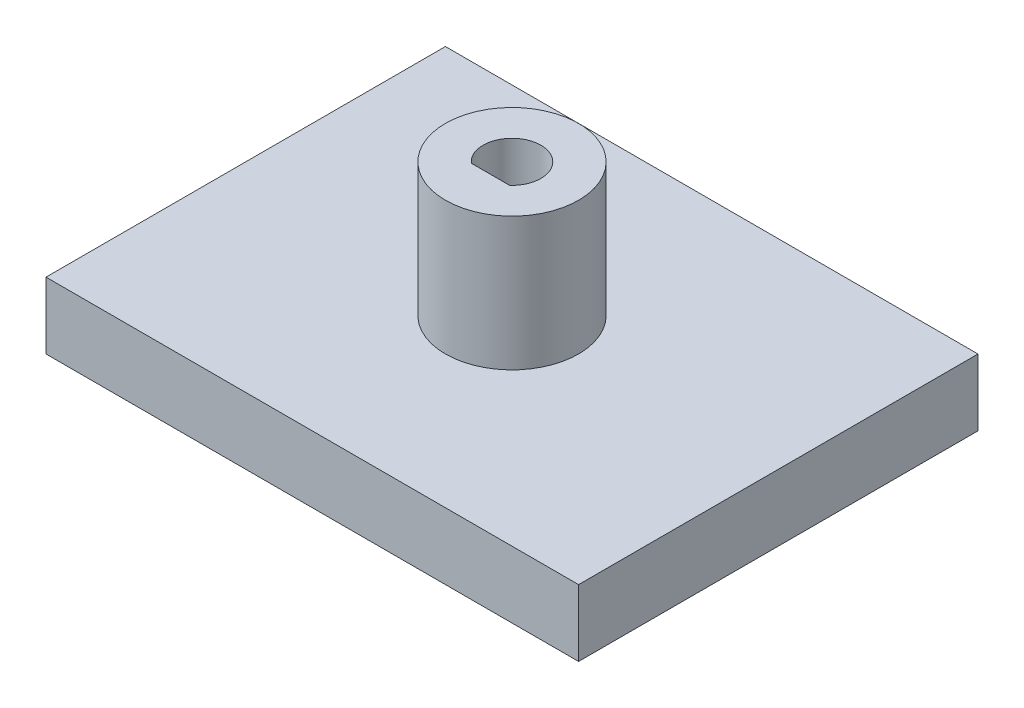
ISO-10303-21;
HEADER;
FILE_DESCRIPTION(('STEP AP214'),'2;1');
FILE_NAME('part.step','',(''),(''),'','','');
FILE_SCHEMA(('AUTOMOTIVE_DESIGN { 1 0 10303 214 1 1 1 1 }'));
ENDSEC;
DATA;
#1=APPLICATION_CONTEXT('core data for automotive mechanical design processes');
#2=APPLICATION_PROTOCOL_DEFINITION('international standard','automotive_design',2000,#1);
#3=PRODUCT_CONTEXT('',#1,'mechanical');
#4=PRODUCT('Part','Part','',(#3));
#5=PRODUCT_RELATED_PRODUCT_CATEGORY('part','',(#4));
#6=PRODUCT_DEFINITION_FORMATION('','',#4);
#7=PRODUCT_DEFINITION_CONTEXT('part definition',#1,'design');
#8=PRODUCT_DEFINITION('design','',#6,#7);
#9=PRODUCT_DEFINITION_SHAPE('','',#8);
#10=(LENGTH_UNIT() NAMED_UNIT(*) SI_UNIT(.MILLI.,.METRE.));
#11=(NAMED_UNIT(*) PLANE_ANGLE_UNIT() SI_UNIT($,.RADIAN.));
#12=(NAMED_UNIT(*) SI_UNIT($,.STERADIAN.) SOLID_ANGLE_UNIT());
#13=UNCERTAINTY_MEASURE_WITH_UNIT(LENGTH_MEASURE(1.E-05),#10,'distance_accuracy_value','');
#14=(GEOMETRIC_REPRESENTATION_CONTEXT(3) GLOBAL_UNCERTAINTY_ASSIGNED_CONTEXT((#13)) GLOBAL_UNIT_ASSIGNED_CONTEXT((#10,
#11,#12)) REPRESENTATION_CONTEXT('',''));
#15=CARTESIAN_POINT('',(0.,0.,0.));
#16=DIRECTION('',(0.,0.,1.));
#17=DIRECTION('',(1.,0.,0.));
#18=AXIS2_PLACEMENT_3D('',#15,#16,#17);
#19=CARTESIAN_POINT('',(0.,6.35,0.));
#20=DIRECTION('',(0.,-1.,0.));
#21=DIRECTION('',(0.,0.,-1.));
#22=AXIS2_PLACEMENT_3D('',#19,#20,#21);
#23=PLANE('',#22);
#24=DIRECTION('',(0.,0.,1.));
#25=VECTOR('',#24,1.);
#26=CARTESIAN_POINT('',(0.,6.35,0.));
#27=LINE('',#26,#25);
#28=CARTESIAN_POINT('',(0.,6.35,-38.1));
#29=VERTEX_POINT('',#28);
#30=CARTESIAN_POINT('',(0.,6.35,0.));
#31=VERTEX_POINT('',#30);
#32=EDGE_CURVE('E135',#29,#31,#27,.T.);
#33=ORIENTED_EDGE('',*,*,#32,.T.);
#34=DIRECTION('',(1.,0.,0.));
#35=VECTOR('',#34,1.);
#36=CARTESIAN_POINT('',(0.,6.35,0.));
#37=LINE('',#36,#35);
#38=CARTESIAN_POINT('',(50.8,6.35,0.));
#39=VERTEX_POINT('',#38);
#40=EDGE_CURVE('E94',#31,#39,#37,.T.);
#41=ORIENTED_EDGE('',*,*,#40,.T.);
#42=DIRECTION('',(0.,0.,-1.));
#43=VECTOR('',#42,1.);
#44=CARTESIAN_POINT('',(50.8,6.35,0.));
#45=LINE('',#44,#43);
#46=CARTESIAN_POINT('',(50.8,6.35,-38.1));
#47=VERTEX_POINT('',#46);
#48=EDGE_CURVE('E140',#39,#47,#45,.T.);
#49=ORIENTED_EDGE('',*,*,#48,.T.);
#50=DIRECTION('',(-1.,0.,0.));
#51=VECTOR('',#50,1.);
#52=CARTESIAN_POINT('',(0.,6.35,-38.1));
#53=LINE('',#52,#51);
#54=EDGE_CURVE('E65',#47,#29,#53,.T.);
#55=ORIENTED_EDGE('',*,*,#54,.T.);
#56=EDGE_LOOP('',(#33,#41,#49,#55));
#57=FACE_BOUND('',#56,.T.);
#58=CARTESIAN_POINT('',(25.4,6.35,-19.05));
#59=DIRECTION('',(0.,1.,0.));
#60=DIRECTION('',(0.,0.,1.));
#61=AXIS2_PLACEMENT_3D('',#58,#59,#60);
#62=CIRCLE('',#61,6.35);
#63=CARTESIAN_POINT('',(25.4,6.35,-12.7));
#64=VERTEX_POINT('',#63);
#65=EDGE_CURVE('E11',#64,#64,#62,.T.);
#66=ORIENTED_EDGE('',*,*,#65,.F.);
#67=EDGE_LOOP('',(#66));
#68=FACE_BOUND('',#67,.T.);
#69=ADVANCED_FACE('F39',(#57,#68),#23,.F.);
#70=CARTESIAN_POINT('',(0.,6.35,0.));
#71=DIRECTION('',(1.,0.,0.));
#72=DIRECTION('',(0.,0.,-1.));
#73=AXIS2_PLACEMENT_3D('',#70,#71,#72);
#74=PLANE('',#73);
#75=DIRECTION('',(0.,0.,1.));
#76=VECTOR('',#75,1.);
#77=CARTESIAN_POINT('',(0.,0.,0.));
#78=LINE('',#77,#76);
#79=CARTESIAN_POINT('',(0.,0.,-38.1));
#80=VERTEX_POINT('',#79);
#81=CARTESIAN_POINT('',(0.,0.,0.));
#82=VERTEX_POINT('',#81);
#83=EDGE_CURVE('E133',#80,#82,#78,.T.);
#84=ORIENTED_EDGE('',*,*,#83,.T.);
#85=DIRECTION('',(0.,-1.,0.));
#86=VECTOR('',#85,1.);
#87=CARTESIAN_POINT('',(0.,6.35,0.));
#88=LINE('',#87,#86);
#89=EDGE_CURVE('E43',#31,#82,#88,.T.);
#90=ORIENTED_EDGE('',*,*,#89,.F.);
#91=ORIENTED_EDGE('',*,*,#32,.F.);
#92=DIRECTION('',(0.,-1.,0.));
#93=VECTOR('',#92,1.);
#94=CARTESIAN_POINT('',(0.,6.35,-38.1));
#95=LINE('',#94,#93);
#96=EDGE_CURVE('E145',#29,#80,#95,.T.);
#97=ORIENTED_EDGE('',*,*,#96,.T.);
#98=EDGE_LOOP('',(#84,#90,#91,#97));
#99=FACE_BOUND('',#98,.T.);
#100=ADVANCED_FACE('F41',(#99),#74,.F.);
#101=CARTESIAN_POINT('',(0.,6.35,0.));
#102=DIRECTION('',(0.,0.,-1.));
#103=DIRECTION('',(-1.,0.,0.));
#104=AXIS2_PLACEMENT_3D('',#101,#102,#103);
#105=PLANE('',#104);
#106=DIRECTION('',(1.,0.,0.));
#107=VECTOR('',#106,1.);
#108=CARTESIAN_POINT('',(0.,0.,0.));
#109=LINE('',#108,#107);
#110=CARTESIAN_POINT('',(50.8,0.,0.));
#111=VERTEX_POINT('',#110);
#112=EDGE_CURVE('E149',#82,#111,#109,.T.);
#113=ORIENTED_EDGE('',*,*,#112,.T.);
#114=DIRECTION('',(0.,-1.,0.));
#115=VECTOR('',#114,1.);
#116=CARTESIAN_POINT('',(50.8,6.35,0.));
#117=LINE('',#116,#115);
#118=EDGE_CURVE('E161',#39,#111,#117,.T.);
#119=ORIENTED_EDGE('',*,*,#118,.F.);
#120=ORIENTED_EDGE('',*,*,#40,.F.);
#121=ORIENTED_EDGE('',*,*,#89,.T.);
#122=EDGE_LOOP('',(#113,#119,#120,#121));
#123=FACE_BOUND('',#122,.T.);
#124=ADVANCED_FACE('F169',(#123),#105,.F.);
#125=CARTESIAN_POINT('',(50.8,6.35,0.));
#126=DIRECTION('',(-1.,0.,0.));
#127=DIRECTION('',(0.,0.,1.));
#128=AXIS2_PLACEMENT_3D('',#125,#126,#127);
#129=PLANE('',#128);
#130=DIRECTION('',(0.,0.,-1.));
#131=VECTOR('',#130,1.);
#132=CARTESIAN_POINT('',(50.8,0.,0.));
#133=LINE('',#132,#131);
#134=CARTESIAN_POINT('',(50.8,0.,-38.1));
#135=VERTEX_POINT('',#134);
#136=EDGE_CURVE('E152',#111,#135,#133,.T.);
#137=ORIENTED_EDGE('',*,*,#136,.T.);
#138=DIRECTION('',(0.,-1.,0.));
#139=VECTOR('',#138,1.);
#140=CARTESIAN_POINT('',(50.8,6.35,-38.1));
#141=LINE('',#140,#139);
#142=EDGE_CURVE('E159',#47,#135,#141,.T.);
#143=ORIENTED_EDGE('',*,*,#142,.F.);
#144=ORIENTED_EDGE('',*,*,#48,.F.);
#145=ORIENTED_EDGE('',*,*,#118,.T.);
#146=EDGE_LOOP('',(#137,#143,#144,#145));
#147=FACE_BOUND('',#146,.T.);
#148=ADVANCED_FACE('F176',(#147),#129,.F.);
#149=CARTESIAN_POINT('',(0.,6.35,-38.1));
#150=DIRECTION('',(0.,0.,1.));
#151=DIRECTION('',(1.,0.,0.));
#152=AXIS2_PLACEMENT_3D('',#149,#150,#151);
#153=PLANE('',#152);
#154=DIRECTION('',(-1.,0.,0.));
#155=VECTOR('',#154,1.);
#156=CARTESIAN_POINT('',(0.,0.,-38.1));
#157=LINE('',#156,#155);
#158=EDGE_CURVE('E86',#135,#80,#157,.T.);
#159=ORIENTED_EDGE('',*,*,#158,.T.);
#160=ORIENTED_EDGE('',*,*,#96,.F.);
#161=ORIENTED_EDGE('',*,*,#54,.F.);
#162=ORIENTED_EDGE('',*,*,#142,.T.);
#163=EDGE_LOOP('',(#159,#160,#161,#162));
#164=FACE_BOUND('',#163,.T.);
#165=ADVANCED_FACE('F177',(#164),#153,.F.);
#166=CARTESIAN_POINT('',(0.,0.,0.));
#167=DIRECTION('',(0.,-1.,0.));
#168=DIRECTION('',(0.,0.,-1.));
#169=AXIS2_PLACEMENT_3D('',#166,#167,#168);
#170=PLANE('',#169);
#171=ORIENTED_EDGE('',*,*,#83,.F.);
#172=ORIENTED_EDGE('',*,*,#158,.F.);
#173=ORIENTED_EDGE('',*,*,#136,.F.);
#174=ORIENTED_EDGE('',*,*,#112,.F.);
#175=EDGE_LOOP('',(#171,#172,#173,#174));
#176=FACE_BOUND('',#175,.T.);
#177=ADVANCED_FACE('F174',(#176),#170,.T.);
#178=CARTESIAN_POINT('',(25.4,19.05,-19.05));
#179=DIRECTION('',(0.,1.,0.));
#180=DIRECTION('',(0.,0.,1.));
#181=AXIS2_PLACEMENT_3D('',#178,#179,#180);
#182=PLANE('',#181);
#183=CARTESIAN_POINT('',(25.4,19.05,-19.05));
#184=DIRECTION('',(0.,1.,0.));
#185=DIRECTION('',(0.,0.,1.));
#186=AXIS2_PLACEMENT_3D('',#183,#184,#185);
#187=CIRCLE('',#186,6.35);
#188=CARTESIAN_POINT('',(25.4,19.05,-12.7));
#189=VERTEX_POINT('',#188);
#190=EDGE_CURVE('E130',#189,#189,#187,.T.);
#191=ORIENTED_EDGE('',*,*,#190,.T.);
#192=EDGE_LOOP('',(#191));
#193=FACE_BOUND('',#192,.T.);
#194=DIRECTION('',(1.,0.,0.));
#195=VECTOR('',#194,1.);
#196=CARTESIAN_POINT('',(23.5702195406006,19.05,-16.9926));
#197=LINE('',#196,#195);
#198=CARTESIAN_POINT('',(23.5702195406006,19.05,-16.9926));
#199=VERTEX_POINT('',#198);
#200=CARTESIAN_POINT('',(27.2297804593994,19.05,-16.9926));
#201=VERTEX_POINT('',#200);
#202=EDGE_CURVE('E102',#199,#201,#197,.T.);
#203=ORIENTED_EDGE('',*,*,#202,.F.);
#204=CARTESIAN_POINT('',(25.4,19.05,-19.05));
#205=DIRECTION('',(0.,1.,0.));
#206=DIRECTION('',(0.,0.,1.));
#207=AXIS2_PLACEMENT_3D('',#204,#205,#206);
#208=CIRCLE('',#207,2.75336);
#209=EDGE_CURVE('E110',#201,#199,#208,.T.);
#210=ORIENTED_EDGE('',*,*,#209,.F.);
#211=EDGE_LOOP('',(#203,#210));
#212=FACE_BOUND('',#211,.T.);
#213=ADVANCED_FACE('F119',(#193,#212),#182,.T.);
#214=CARTESIAN_POINT('',(25.4,19.05,-19.05));
#215=DIRECTION('',(0.,-1.,0.));
#216=DIRECTION('',(0.,0.,-1.));
#217=AXIS2_PLACEMENT_3D('',#214,#215,#216);
#218=CYLINDRICAL_SURFACE('',#217,6.35);
#219=ORIENTED_EDGE('',*,*,#190,.F.);
#220=EDGE_LOOP('',(#219));
#221=FACE_BOUND('',#220,.T.);
#222=ORIENTED_EDGE('',*,*,#65,.T.);
#223=EDGE_LOOP('',(#222));
#224=FACE_BOUND('',#223,.T.);
#225=ADVANCED_FACE('F184',(#221,#224),#218,.T.);
#226=CARTESIAN_POINT('',(25.4,19.05,-19.05));
#227=DIRECTION('',(0.,-1.,0.));
#228=DIRECTION('',(0.,0.,-1.));
#229=AXIS2_PLACEMENT_3D('',#226,#227,#228);
#230=CYLINDRICAL_SURFACE('',#229,2.75336);
#231=CARTESIAN_POINT('',(25.4,6.35,-19.05));
#232=DIRECTION('',(0.,1.,0.));
#233=DIRECTION('',(0.,0.,1.));
#234=AXIS2_PLACEMENT_3D('',#231,#232,#233);
#235=CIRCLE('',#234,2.75336);
#236=CARTESIAN_POINT('',(27.2297804593994,6.35,-16.9926));
#237=VERTEX_POINT('',#236);
#238=CARTESIAN_POINT('',(23.5702195406006,6.35,-16.9926));
#239=VERTEX_POINT('',#238);
#240=EDGE_CURVE('E115',#237,#239,#235,.T.);
#241=ORIENTED_EDGE('',*,*,#240,.F.);
#242=DIRECTION('',(0.,-1.,0.));
#243=VECTOR('',#242,1.);
#244=CARTESIAN_POINT('',(27.2297804593994,19.05,-16.9926));
#245=LINE('',#244,#243);
#246=EDGE_CURVE('E56',#201,#237,#245,.T.);
#247=ORIENTED_EDGE('',*,*,#246,.F.);
#248=ORIENTED_EDGE('',*,*,#209,.T.);
#249=DIRECTION('',(0.,-1.,0.));
#250=VECTOR('',#249,1.);
#251=CARTESIAN_POINT('',(23.5702195406006,19.05,-16.9926));
#252=LINE('',#251,#250);
#253=EDGE_CURVE('E105',#199,#239,#252,.T.);
#254=ORIENTED_EDGE('',*,*,#253,.T.);
#255=EDGE_LOOP('',(#241,#247,#248,#254));
#256=FACE_BOUND('',#255,.T.);
#257=ADVANCED_FACE('F113',(#256),#230,.F.);
#258=CARTESIAN_POINT('',(23.5702195406006,19.05,-16.9926));
#259=DIRECTION('',(0.,0.,-1.));
#260=DIRECTION('',(-1.,0.,0.));
#261=AXIS2_PLACEMENT_3D('',#258,#259,#260);
#262=PLANE('',#261);
#263=DIRECTION('',(1.,0.,0.));
#264=VECTOR('',#263,1.);
#265=CARTESIAN_POINT('',(23.5702195406006,6.35,-16.9926));
#266=LINE('',#265,#264);
#267=EDGE_CURVE('E121',#239,#237,#266,.T.);
#268=ORIENTED_EDGE('',*,*,#267,.F.);
#269=ORIENTED_EDGE('',*,*,#253,.F.);
#270=ORIENTED_EDGE('',*,*,#202,.T.);
#271=ORIENTED_EDGE('',*,*,#246,.T.);
#272=EDGE_LOOP('',(#268,#269,#270,#271));
#273=FACE_BOUND('',#272,.T.);
#274=ADVANCED_FACE('F103',(#273),#262,.T.);
#275=ORIENTED_EDGE('',*,*,#267,.T.);
#276=ORIENTED_EDGE('',*,*,#240,.T.);
#277=EDGE_LOOP('',(#275,#276));
#278=FACE_BOUND('',#277,.T.);
#279=ADVANCED_FACE('F181',(#278),#23,.F.);
#280=CLOSED_SHELL('',(#69,#100,#124,#148,#165,#177,#213,#225,#257,#274,#279));
#281=MANIFOLD_SOLID_BREP('B2',#280);
#282=ADVANCED_BREP_SHAPE_REPRESENTATION('',(#18,#281),#14);
#283=SHAPE_DEFINITION_REPRESENTATION(#9,#282);
ENDSEC;
END-ISO-10303-21;
